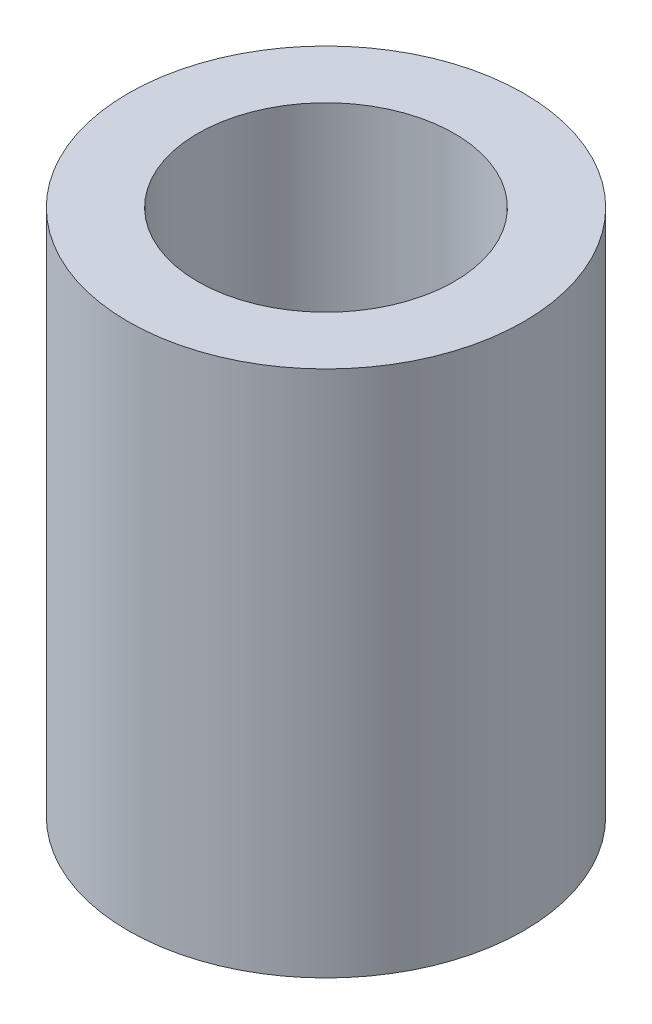
ISO-10303-21;
HEADER;
FILE_DESCRIPTION(('STEP AP214'),'2;1');
FILE_NAME('part.step','',(''),(''),'','','');
FILE_SCHEMA(('AUTOMOTIVE_DESIGN { 1 0 10303 214 1 1 1 1 }'));
ENDSEC;
DATA;
#1=APPLICATION_CONTEXT('core data for automotive mechanical design processes');
#2=APPLICATION_PROTOCOL_DEFINITION('international standard','automotive_design',2000,#1);
#3=PRODUCT_CONTEXT('',#1,'mechanical');
#4=PRODUCT('Part','Part','',(#3));
#5=PRODUCT_RELATED_PRODUCT_CATEGORY('part','',(#4));
#6=PRODUCT_DEFINITION_FORMATION('','',#4);
#7=PRODUCT_DEFINITION_CONTEXT('part definition',#1,'design');
#8=PRODUCT_DEFINITION('design','',#6,#7);
#9=PRODUCT_DEFINITION_SHAPE('','',#8);
#10=(LENGTH_UNIT() NAMED_UNIT(*) SI_UNIT(.MILLI.,.METRE.));
#11=(NAMED_UNIT(*) PLANE_ANGLE_UNIT() SI_UNIT($,.RADIAN.));
#12=(NAMED_UNIT(*) SI_UNIT($,.STERADIAN.) SOLID_ANGLE_UNIT());
#13=UNCERTAINTY_MEASURE_WITH_UNIT(LENGTH_MEASURE(1.E-05),#10,'distance_accuracy_value','');
#14=(GEOMETRIC_REPRESENTATION_CONTEXT(3) GLOBAL_UNCERTAINTY_ASSIGNED_CONTEXT((#13)) GLOBAL_UNIT_ASSIGNED_CONTEXT((#10,
#11,#12)) REPRESENTATION_CONTEXT('',''));
#15=CARTESIAN_POINT('',(0.,0.,0.));
#16=DIRECTION('',(0.,0.,1.));
#17=DIRECTION('',(1.,0.,0.));
#18=AXIS2_PLACEMENT_3D('',#15,#16,#17);
#19=CARTESIAN_POINT('',(0.,10.2777777777778,0.));
#20=DIRECTION('',(0.,1.,0.));
#21=DIRECTION('',(0.,0.,1.));
#22=AXIS2_PLACEMENT_3D('',#19,#20,#21);
#23=PLANE('',#22);
#24=CARTESIAN_POINT('',(0.,10.2777777777778,0.));
#25=DIRECTION('',(0.,1.,0.));
#26=DIRECTION('',(0.,0.,1.));
#27=AXIS2_PLACEMENT_3D('',#24,#25,#26);
#28=CIRCLE('',#27,7.70833333333333);
#29=CARTESIAN_POINT('',(0.,10.2777777777778,7.70833333333333));
#30=VERTEX_POINT('',#29);
#31=EDGE_CURVE('E10',#30,#30,#28,.T.);
#32=ORIENTED_EDGE('',*,*,#31,.T.);
#33=EDGE_LOOP('',(#32));
#34=FACE_BOUND('',#33,.T.);
#35=CARTESIAN_POINT('',(0.,10.2777777777778,0.));
#36=DIRECTION('',(0.,1.,0.));
#37=DIRECTION('',(0.,0.,1.));
#38=AXIS2_PLACEMENT_3D('',#35,#36,#37);
#39=CIRCLE('',#38,5.);
#40=CARTESIAN_POINT('',(0.,10.2777777777778,5.));
#41=VERTEX_POINT('',#40);
#42=EDGE_CURVE('E50',#41,#41,#39,.T.);
#43=ORIENTED_EDGE('',*,*,#42,.F.);
#44=EDGE_LOOP('',(#43));
#45=FACE_BOUND('',#44,.T.);
#46=ADVANCED_FACE('F37',(#34,#45),#23,.T.);
#47=CARTESIAN_POINT('',(0.,-10.2777777777778,0.));
#48=DIRECTION('',(0.,1.,0.));
#49=DIRECTION('',(0.,0.,1.));
#50=AXIS2_PLACEMENT_3D('',#47,#48,#49);
#51=PLANE('',#50);
#52=CARTESIAN_POINT('',(0.,-10.2777777777778,0.));
#53=DIRECTION('',(0.,1.,0.));
#54=DIRECTION('',(0.,0.,1.));
#55=AXIS2_PLACEMENT_3D('',#52,#53,#54);
#56=CIRCLE('',#55,7.70833333333333);
#57=CARTESIAN_POINT('',(0.,-10.2777777777778,7.70833333333333));
#58=VERTEX_POINT('',#57);
#59=EDGE_CURVE('E41',#58,#58,#56,.T.);
#60=ORIENTED_EDGE('',*,*,#59,.F.);
#61=EDGE_LOOP('',(#60));
#62=FACE_BOUND('',#61,.T.);
#63=CARTESIAN_POINT('',(0.,-10.2777777777778,0.));
#64=DIRECTION('',(0.,1.,0.));
#65=DIRECTION('',(0.,0.,1.));
#66=AXIS2_PLACEMENT_3D('',#63,#64,#65);
#67=CIRCLE('',#66,5.);
#68=CARTESIAN_POINT('',(0.,-10.2777777777778,5.));
#69=VERTEX_POINT('',#68);
#70=EDGE_CURVE('E52',#69,#69,#67,.T.);
#71=ORIENTED_EDGE('',*,*,#70,.T.);
#72=EDGE_LOOP('',(#71));
#73=FACE_BOUND('',#72,.T.);
#74=ADVANCED_FACE('F64',(#62,#73),#51,.F.);
#75=CARTESIAN_POINT('',(0.,10.2777777777778,0.));
#76=DIRECTION('',(0.,-1.,0.));
#77=DIRECTION('',(0.,0.,-1.));
#78=AXIS2_PLACEMENT_3D('',#75,#76,#77);
#79=CYLINDRICAL_SURFACE('',#78,7.70833333333333);
#80=ORIENTED_EDGE('',*,*,#31,.F.);
#81=EDGE_LOOP('',(#80));
#82=FACE_BOUND('',#81,.T.);
#83=ORIENTED_EDGE('',*,*,#59,.T.);
#84=EDGE_LOOP('',(#83));
#85=FACE_BOUND('',#84,.T.);
#86=ADVANCED_FACE('F39',(#82,#85),#79,.T.);
#87=CARTESIAN_POINT('',(0.,10.2777777777778,0.));
#88=DIRECTION('',(0.,-1.,0.));
#89=DIRECTION('',(0.,0.,-1.));
#90=AXIS2_PLACEMENT_3D('',#87,#88,#89);
#91=CYLINDRICAL_SURFACE('',#90,5.);
#92=ORIENTED_EDGE('',*,*,#42,.T.);
#93=EDGE_LOOP('',(#92));
#94=FACE_BOUND('',#93,.T.);
#95=ORIENTED_EDGE('',*,*,#70,.F.);
#96=EDGE_LOOP('',(#95));
#97=FACE_BOUND('',#96,.T.);
#98=ADVANCED_FACE('F60',(#94,#97),#91,.F.);
#99=CLOSED_SHELL('',(#46,#74,#86,#98));
#100=MANIFOLD_SOLID_BREP('B2',#99);
#101=ADVANCED_BREP_SHAPE_REPRESENTATION('',(#18,#100),#14);
#102=SHAPE_DEFINITION_REPRESENTATION(#9,#101);
ENDSEC;
END-ISO-10303-21;
